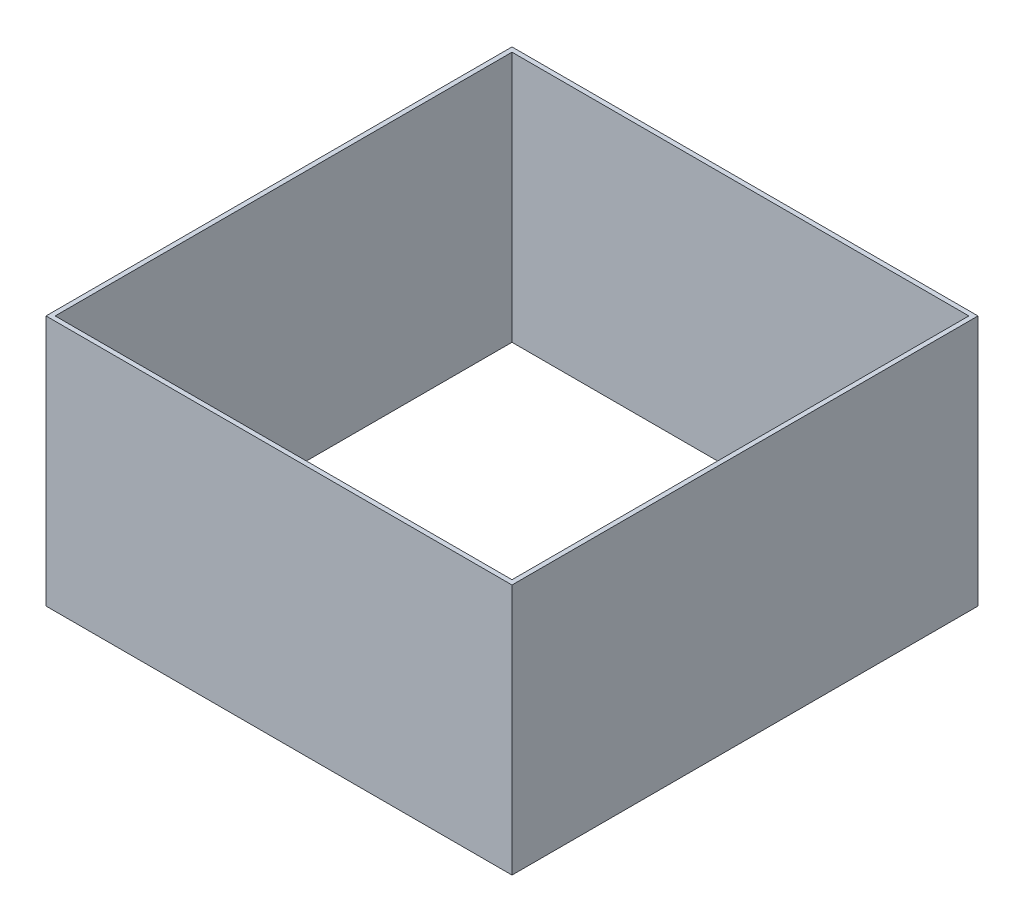
ISO-10303-21;
HEADER;
FILE_DESCRIPTION(('STEP AP214'),'2;1');
FILE_NAME('part.step','',(''),(''),'','','');
FILE_SCHEMA(('AUTOMOTIVE_DESIGN { 1 0 10303 214 1 1 1 1 }'));
ENDSEC;
DATA;
#1=APPLICATION_CONTEXT('core data for automotive mechanical design processes');
#2=APPLICATION_PROTOCOL_DEFINITION('international standard','automotive_design',2000,#1);
#3=PRODUCT_CONTEXT('',#1,'mechanical');
#4=PRODUCT('Part','Part','',(#3));
#5=PRODUCT_RELATED_PRODUCT_CATEGORY('part','',(#4));
#6=PRODUCT_DEFINITION_FORMATION('','',#4);
#7=PRODUCT_DEFINITION_CONTEXT('part definition',#1,'design');
#8=PRODUCT_DEFINITION('design','',#6,#7);
#9=PRODUCT_DEFINITION_SHAPE('','',#8);
#10=(LENGTH_UNIT() NAMED_UNIT(*) SI_UNIT(.MILLI.,.METRE.));
#11=(NAMED_UNIT(*) PLANE_ANGLE_UNIT() SI_UNIT($,.RADIAN.));
#12=(NAMED_UNIT(*) SI_UNIT($,.STERADIAN.) SOLID_ANGLE_UNIT());
#13=UNCERTAINTY_MEASURE_WITH_UNIT(LENGTH_MEASURE(1.E-05),#10,'distance_accuracy_value','');
#14=(GEOMETRIC_REPRESENTATION_CONTEXT(3) GLOBAL_UNCERTAINTY_ASSIGNED_CONTEXT((#13)) GLOBAL_UNIT_ASSIGNED_CONTEXT((#10,
#11,#12)) REPRESENTATION_CONTEXT('',''));
#15=CARTESIAN_POINT('',(0.,0.,0.));
#16=DIRECTION('',(0.,0.,1.));
#17=DIRECTION('',(1.,0.,0.));
#18=AXIS2_PLACEMENT_3D('',#15,#16,#17);
#19=CARTESIAN_POINT('',(0.,55.,0.));
#20=DIRECTION('',(0.,-1.,0.));
#21=DIRECTION('',(0.,0.,-1.));
#22=AXIS2_PLACEMENT_3D('',#19,#20,#21);
#23=PLANE('',#22);
#24=DIRECTION('',(0.,0.,1.));
#25=VECTOR('',#24,1.);
#26=CARTESIAN_POINT('',(0.,55.,0.));
#27=LINE('',#26,#25);
#28=CARTESIAN_POINT('',(0.,55.,-102.));
#29=VERTEX_POINT('',#28);
#30=CARTESIAN_POINT('',(0.,55.,0.));
#31=VERTEX_POINT('',#30);
#32=EDGE_CURVE('E153',#29,#31,#27,.T.);
#33=ORIENTED_EDGE('',*,*,#32,.T.);
#34=DIRECTION('',(1.,0.,0.));
#35=VECTOR('',#34,1.);
#36=CARTESIAN_POINT('',(0.,55.,0.));
#37=LINE('',#36,#35);
#38=CARTESIAN_POINT('',(102.,55.,0.));
#39=VERTEX_POINT('',#38);
#40=EDGE_CURVE('E157',#31,#39,#37,.T.);
#41=ORIENTED_EDGE('',*,*,#40,.T.);
#42=DIRECTION('',(0.,0.,-1.));
#43=VECTOR('',#42,1.);
#44=CARTESIAN_POINT('',(102.,55.,0.));
#45=LINE('',#44,#43);
#46=CARTESIAN_POINT('',(102.,55.,-102.));
#47=VERTEX_POINT('',#46);
#48=EDGE_CURVE('E161',#39,#47,#45,.T.);
#49=ORIENTED_EDGE('',*,*,#48,.T.);
#50=DIRECTION('',(-1.,0.,0.));
#51=VECTOR('',#50,1.);
#52=CARTESIAN_POINT('',(0.,55.,-102.));
#53=LINE('',#52,#51);
#54=EDGE_CURVE('E164',#47,#29,#53,.T.);
#55=ORIENTED_EDGE('',*,*,#54,.T.);
#56=EDGE_LOOP('',(#33,#41,#49,#55));
#57=FACE_BOUND('',#56,.T.);
#58=DIRECTION('',(0.,0.,1.));
#59=VECTOR('',#58,1.);
#60=CARTESIAN_POINT('',(1.,55.,-1.));
#61=LINE('',#60,#59);
#62=CARTESIAN_POINT('',(1.,55.,-101.));
#63=VERTEX_POINT('',#62);
#64=CARTESIAN_POINT('',(1.,55.,-1.));
#65=VERTEX_POINT('',#64);
#66=EDGE_CURVE('E105',#63,#65,#61,.T.);
#67=ORIENTED_EDGE('',*,*,#66,.F.);
#68=DIRECTION('',(-1.,0.,0.));
#69=VECTOR('',#68,1.);
#70=CARTESIAN_POINT('',(1.,55.,-101.));
#71=LINE('',#70,#69);
#72=CARTESIAN_POINT('',(101.,55.,-101.));
#73=VERTEX_POINT('',#72);
#74=EDGE_CURVE('E131',#73,#63,#71,.T.);
#75=ORIENTED_EDGE('',*,*,#74,.F.);
#76=DIRECTION('',(0.,0.,-1.));
#77=VECTOR('',#76,1.);
#78=CARTESIAN_POINT('',(101.,55.,-1.));
#79=LINE('',#78,#77);
#80=CARTESIAN_POINT('',(101.,55.,-1.));
#81=VERTEX_POINT('',#80);
#82=EDGE_CURVE('E127',#81,#73,#79,.T.);
#83=ORIENTED_EDGE('',*,*,#82,.F.);
#84=DIRECTION('',(1.,0.,0.));
#85=VECTOR('',#84,1.);
#86=CARTESIAN_POINT('',(1.,55.,-1.));
#87=LINE('',#86,#85);
#88=EDGE_CURVE('E114',#65,#81,#87,.T.);
#89=ORIENTED_EDGE('',*,*,#88,.F.);
#90=EDGE_LOOP('',(#67,#75,#83,#89));
#91=FACE_BOUND('',#90,.T.);
#92=ADVANCED_FACE('F39',(#57,#91),#23,.F.);
#93=CARTESIAN_POINT('',(0.,0.,0.));
#94=DIRECTION('',(0.,-1.,0.));
#95=DIRECTION('',(0.,0.,-1.));
#96=AXIS2_PLACEMENT_3D('',#93,#94,#95);
#97=PLANE('',#96);
#98=DIRECTION('',(0.,0.,1.));
#99=VECTOR('',#98,1.);
#100=CARTESIAN_POINT('',(0.,0.,0.));
#101=LINE('',#100,#99);
#102=CARTESIAN_POINT('',(0.,0.,-102.));
#103=VERTEX_POINT('',#102);
#104=CARTESIAN_POINT('',(0.,0.,0.));
#105=VERTEX_POINT('',#104);
#106=EDGE_CURVE('E123',#103,#105,#101,.T.);
#107=ORIENTED_EDGE('',*,*,#106,.F.);
#108=DIRECTION('',(-1.,0.,0.));
#109=VECTOR('',#108,1.);
#110=CARTESIAN_POINT('',(0.,0.,-102.));
#111=LINE('',#110,#109);
#112=CARTESIAN_POINT('',(102.,0.,-102.));
#113=VERTEX_POINT('',#112);
#114=EDGE_CURVE('E158',#113,#103,#111,.T.);
#115=ORIENTED_EDGE('',*,*,#114,.F.);
#116=DIRECTION('',(0.,0.,-1.));
#117=VECTOR('',#116,1.);
#118=CARTESIAN_POINT('',(102.,0.,0.));
#119=LINE('',#118,#117);
#120=CARTESIAN_POINT('',(102.,0.,0.));
#121=VERTEX_POINT('',#120);
#122=EDGE_CURVE('E174',#121,#113,#119,.T.);
#123=ORIENTED_EDGE('',*,*,#122,.F.);
#124=DIRECTION('',(1.,0.,0.));
#125=VECTOR('',#124,1.);
#126=CARTESIAN_POINT('',(0.,0.,0.));
#127=LINE('',#126,#125);
#128=EDGE_CURVE('E171',#105,#121,#127,.T.);
#129=ORIENTED_EDGE('',*,*,#128,.F.);
#130=EDGE_LOOP('',(#107,#115,#123,#129));
#131=FACE_BOUND('',#130,.T.);
#132=DIRECTION('',(-1.,0.,0.));
#133=VECTOR('',#132,1.);
#134=CARTESIAN_POINT('',(1.,0.,-101.));
#135=LINE('',#134,#133);
#136=CARTESIAN_POINT('',(101.,0.,-101.));
#137=VERTEX_POINT('',#136);
#138=CARTESIAN_POINT('',(1.,0.,-101.));
#139=VERTEX_POINT('',#138);
#140=EDGE_CURVE('E115',#137,#139,#135,.T.);
#141=ORIENTED_EDGE('',*,*,#140,.T.);
#142=DIRECTION('',(0.,0.,1.));
#143=VECTOR('',#142,1.);
#144=CARTESIAN_POINT('',(1.,0.,-1.));
#145=LINE('',#144,#143);
#146=CARTESIAN_POINT('',(1.,0.,-1.));
#147=VERTEX_POINT('',#146);
#148=EDGE_CURVE('E63',#139,#147,#145,.T.);
#149=ORIENTED_EDGE('',*,*,#148,.T.);
#150=DIRECTION('',(1.,0.,0.));
#151=VECTOR('',#150,1.);
#152=CARTESIAN_POINT('',(1.,0.,-1.));
#153=LINE('',#152,#151);
#154=CARTESIAN_POINT('',(101.,0.,-1.));
#155=VERTEX_POINT('',#154);
#156=EDGE_CURVE('E121',#147,#155,#153,.T.);
#157=ORIENTED_EDGE('',*,*,#156,.T.);
#158=DIRECTION('',(0.,0.,-1.));
#159=VECTOR('',#158,1.);
#160=CARTESIAN_POINT('',(101.,0.,-1.));
#161=LINE('',#160,#159);
#162=EDGE_CURVE('E140',#155,#137,#161,.T.);
#163=ORIENTED_EDGE('',*,*,#162,.T.);
#164=EDGE_LOOP('',(#141,#149,#157,#163));
#165=FACE_BOUND('',#164,.T.);
#166=ADVANCED_FACE('F197',(#131,#165),#97,.T.);
#167=CARTESIAN_POINT('',(0.,55.,0.));
#168=DIRECTION('',(1.,0.,0.));
#169=DIRECTION('',(0.,0.,-1.));
#170=AXIS2_PLACEMENT_3D('',#167,#168,#169);
#171=PLANE('',#170);
#172=ORIENTED_EDGE('',*,*,#106,.T.);
#173=DIRECTION('',(0.,-1.,0.));
#174=VECTOR('',#173,1.);
#175=CARTESIAN_POINT('',(0.,55.,0.));
#176=LINE('',#175,#174);
#177=EDGE_CURVE('E11',#31,#105,#176,.T.);
#178=ORIENTED_EDGE('',*,*,#177,.F.);
#179=ORIENTED_EDGE('',*,*,#32,.F.);
#180=DIRECTION('',(0.,-1.,0.));
#181=VECTOR('',#180,1.);
#182=CARTESIAN_POINT('',(0.,55.,-102.));
#183=LINE('',#182,#181);
#184=EDGE_CURVE('E167',#29,#103,#183,.T.);
#185=ORIENTED_EDGE('',*,*,#184,.T.);
#186=EDGE_LOOP('',(#172,#178,#179,#185));
#187=FACE_BOUND('',#186,.T.);
#188=ADVANCED_FACE('F41',(#187),#171,.F.);
#189=CARTESIAN_POINT('',(0.,55.,0.));
#190=DIRECTION('',(0.,0.,-1.));
#191=DIRECTION('',(-1.,0.,0.));
#192=AXIS2_PLACEMENT_3D('',#189,#190,#191);
#193=PLANE('',#192);
#194=ORIENTED_EDGE('',*,*,#128,.T.);
#195=DIRECTION('',(0.,-1.,0.));
#196=VECTOR('',#195,1.);
#197=CARTESIAN_POINT('',(102.,55.,0.));
#198=LINE('',#197,#196);
#199=EDGE_CURVE('E48',#39,#121,#198,.T.);
#200=ORIENTED_EDGE('',*,*,#199,.F.);
#201=ORIENTED_EDGE('',*,*,#40,.F.);
#202=ORIENTED_EDGE('',*,*,#177,.T.);
#203=EDGE_LOOP('',(#194,#200,#201,#202));
#204=FACE_BOUND('',#203,.T.);
#205=ADVANCED_FACE('F207',(#204),#193,.F.);
#206=CARTESIAN_POINT('',(102.,55.,0.));
#207=DIRECTION('',(-1.,0.,0.));
#208=DIRECTION('',(0.,0.,1.));
#209=AXIS2_PLACEMENT_3D('',#206,#207,#208);
#210=PLANE('',#209);
#211=ORIENTED_EDGE('',*,*,#122,.T.);
#212=DIRECTION('',(0.,-1.,0.));
#213=VECTOR('',#212,1.);
#214=CARTESIAN_POINT('',(102.,55.,-102.));
#215=LINE('',#214,#213);
#216=EDGE_CURVE('E182',#47,#113,#215,.T.);
#217=ORIENTED_EDGE('',*,*,#216,.F.);
#218=ORIENTED_EDGE('',*,*,#48,.F.);
#219=ORIENTED_EDGE('',*,*,#199,.T.);
#220=EDGE_LOOP('',(#211,#217,#218,#219));
#221=FACE_BOUND('',#220,.T.);
#222=ADVANCED_FACE('F191',(#221),#210,.F.);
#223=CARTESIAN_POINT('',(0.,55.,-102.));
#224=DIRECTION('',(0.,0.,1.));
#225=DIRECTION('',(1.,0.,0.));
#226=AXIS2_PLACEMENT_3D('',#223,#224,#225);
#227=PLANE('',#226);
#228=ORIENTED_EDGE('',*,*,#114,.T.);
#229=ORIENTED_EDGE('',*,*,#184,.F.);
#230=ORIENTED_EDGE('',*,*,#54,.F.);
#231=ORIENTED_EDGE('',*,*,#216,.T.);
#232=EDGE_LOOP('',(#228,#229,#230,#231));
#233=FACE_BOUND('',#232,.T.);
#234=ADVANCED_FACE('F201',(#233),#227,.F.);
#235=CARTESIAN_POINT('',(1.,55.,-1.));
#236=DIRECTION('',(1.,0.,0.));
#237=DIRECTION('',(0.,0.,-1.));
#238=AXIS2_PLACEMENT_3D('',#235,#236,#237);
#239=PLANE('',#238);
#240=ORIENTED_EDGE('',*,*,#148,.F.);
#241=DIRECTION('',(0.,-1.,0.));
#242=VECTOR('',#241,1.);
#243=CARTESIAN_POINT('',(1.,55.,-101.));
#244=LINE('',#243,#242);
#245=EDGE_CURVE('E109',#63,#139,#244,.T.);
#246=ORIENTED_EDGE('',*,*,#245,.F.);
#247=ORIENTED_EDGE('',*,*,#66,.T.);
#248=DIRECTION('',(0.,-1.,0.));
#249=VECTOR('',#248,1.);
#250=CARTESIAN_POINT('',(1.,55.,-1.));
#251=LINE('',#250,#249);
#252=EDGE_CURVE('E108',#65,#147,#251,.T.);
#253=ORIENTED_EDGE('',*,*,#252,.T.);
#254=EDGE_LOOP('',(#240,#246,#247,#253));
#255=FACE_BOUND('',#254,.T.);
#256=ADVANCED_FACE('F107',(#255),#239,.T.);
#257=CARTESIAN_POINT('',(1.,55.,-1.));
#258=DIRECTION('',(0.,0.,-1.));
#259=DIRECTION('',(-1.,0.,0.));
#260=AXIS2_PLACEMENT_3D('',#257,#258,#259);
#261=PLANE('',#260);
#262=ORIENTED_EDGE('',*,*,#156,.F.);
#263=ORIENTED_EDGE('',*,*,#252,.F.);
#264=ORIENTED_EDGE('',*,*,#88,.T.);
#265=DIRECTION('',(0.,-1.,0.));
#266=VECTOR('',#265,1.);
#267=CARTESIAN_POINT('',(101.,55.,-1.));
#268=LINE('',#267,#266);
#269=EDGE_CURVE('E124',#81,#155,#268,.T.);
#270=ORIENTED_EDGE('',*,*,#269,.T.);
#271=EDGE_LOOP('',(#262,#263,#264,#270));
#272=FACE_BOUND('',#271,.T.);
#273=ADVANCED_FACE('F118',(#272),#261,.T.);
#274=CARTESIAN_POINT('',(101.,55.,-1.));
#275=DIRECTION('',(-1.,0.,0.));
#276=DIRECTION('',(0.,0.,1.));
#277=AXIS2_PLACEMENT_3D('',#274,#275,#276);
#278=PLANE('',#277);
#279=ORIENTED_EDGE('',*,*,#162,.F.);
#280=ORIENTED_EDGE('',*,*,#269,.F.);
#281=ORIENTED_EDGE('',*,*,#82,.T.);
#282=DIRECTION('',(0.,-1.,0.));
#283=VECTOR('',#282,1.);
#284=CARTESIAN_POINT('',(101.,55.,-101.));
#285=LINE('',#284,#283);
#286=EDGE_CURVE('E55',#73,#137,#285,.T.);
#287=ORIENTED_EDGE('',*,*,#286,.T.);
#288=EDGE_LOOP('',(#279,#280,#281,#287));
#289=FACE_BOUND('',#288,.T.);
#290=ADVANCED_FACE('F230',(#289),#278,.T.);
#291=CARTESIAN_POINT('',(1.,55.,-101.));
#292=DIRECTION('',(0.,0.,1.));
#293=DIRECTION('',(1.,0.,0.));
#294=AXIS2_PLACEMENT_3D('',#291,#292,#293);
#295=PLANE('',#294);
#296=ORIENTED_EDGE('',*,*,#140,.F.);
#297=ORIENTED_EDGE('',*,*,#286,.F.);
#298=ORIENTED_EDGE('',*,*,#74,.T.);
#299=ORIENTED_EDGE('',*,*,#245,.T.);
#300=EDGE_LOOP('',(#296,#297,#298,#299));
#301=FACE_BOUND('',#300,.T.);
#302=ADVANCED_FACE('F234',(#301),#295,.T.);
#303=CLOSED_SHELL('',(#92,#166,#188,#205,#222,#234,#256,#273,#290,#302));
#304=MANIFOLD_SOLID_BREP('B2',#303);
#305=ADVANCED_BREP_SHAPE_REPRESENTATION('',(#18,#304),#14);
#306=SHAPE_DEFINITION_REPRESENTATION(#9,#305);
ENDSEC;
END-ISO-10303-21;
